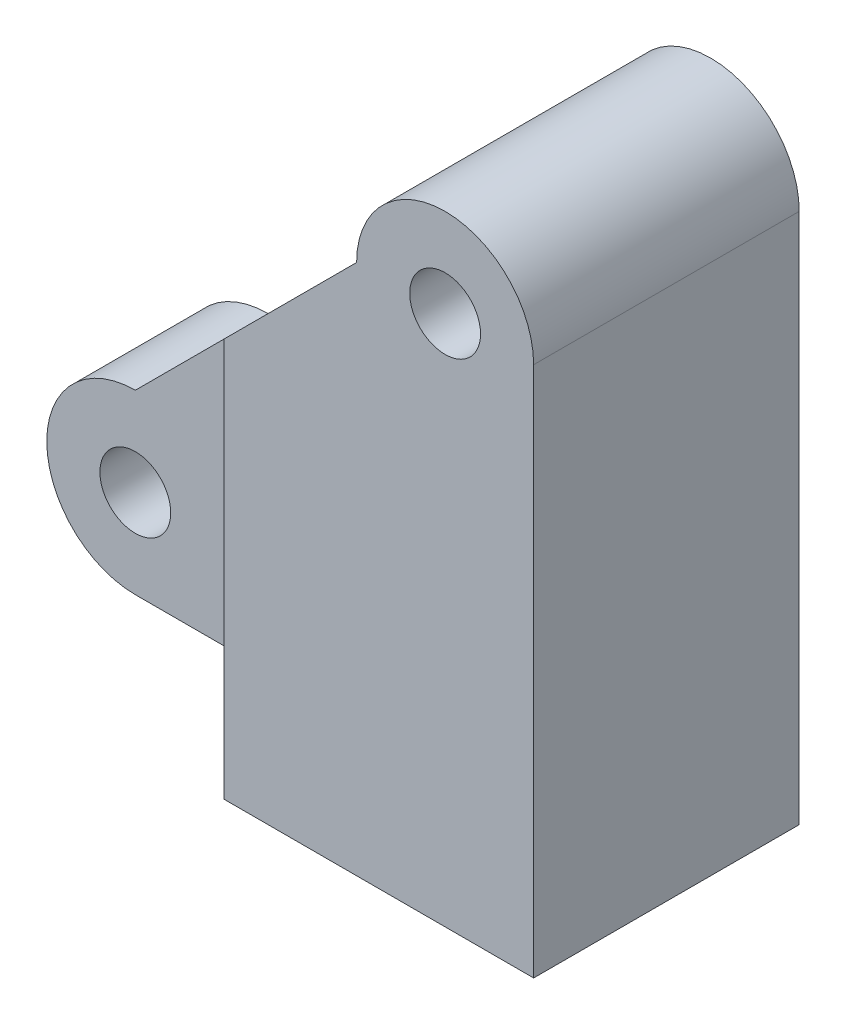
ISO-10303-21;
HEADER;
FILE_DESCRIPTION(('STEP AP214'),'2;1');
FILE_NAME('part.step','',(''),(''),'','','');
FILE_SCHEMA(('AUTOMOTIVE_DESIGN { 1 0 10303 214 1 1 1 1 }'));
ENDSEC;
DATA;
#1=APPLICATION_CONTEXT('core data for automotive mechanical design processes');
#2=APPLICATION_PROTOCOL_DEFINITION('international standard','automotive_design',2000,#1);
#3=PRODUCT_CONTEXT('',#1,'mechanical');
#4=PRODUCT('Part','Part','',(#3));
#5=PRODUCT_RELATED_PRODUCT_CATEGORY('part','',(#4));
#6=PRODUCT_DEFINITION_FORMATION('','',#4);
#7=PRODUCT_DEFINITION_CONTEXT('part definition',#1,'design');
#8=PRODUCT_DEFINITION('design','',#6,#7);
#9=PRODUCT_DEFINITION_SHAPE('','',#8);
#10=(LENGTH_UNIT() NAMED_UNIT(*) SI_UNIT(.MILLI.,.METRE.));
#11=(NAMED_UNIT(*) PLANE_ANGLE_UNIT() SI_UNIT($,.RADIAN.));
#12=(NAMED_UNIT(*) SI_UNIT($,.STERADIAN.) SOLID_ANGLE_UNIT());
#13=UNCERTAINTY_MEASURE_WITH_UNIT(LENGTH_MEASURE(1.E-05),#10,'distance_accuracy_value','');
#14=(GEOMETRIC_REPRESENTATION_CONTEXT(3) GLOBAL_UNCERTAINTY_ASSIGNED_CONTEXT((#13)) GLOBAL_UNIT_ASSIGNED_CONTEXT((#10,
#11,#12)) REPRESENTATION_CONTEXT('',''));
#15=CARTESIAN_POINT('',(0.,0.,0.));
#16=DIRECTION('',(0.,0.,1.));
#17=DIRECTION('',(1.,0.,0.));
#18=AXIS2_PLACEMENT_3D('',#15,#16,#17);
#19=CARTESIAN_POINT('',(0.,0.,30.));
#20=DIRECTION('',(0.,0.,-1.));
#21=DIRECTION('',(-1.,0.,0.));
#22=AXIS2_PLACEMENT_3D('',#19,#20,#21);
#23=CYLINDRICAL_SURFACE('',#22,10.);
#24=CARTESIAN_POINT('',(0.,0.,15.));
#25=DIRECTION('',(0.,0.,1.));
#26=DIRECTION('',(1.,0.,0.));
#27=AXIS2_PLACEMENT_3D('',#24,#25,#26);
#28=CIRCLE('',#27,10.);
#29=CARTESIAN_POINT('',(0.,9.99999999999999,15.));
#30=VERTEX_POINT('',#29);
#31=CARTESIAN_POINT('',(0.,-10.,15.));
#32=VERTEX_POINT('',#31);
#33=EDGE_CURVE('E114',#30,#32,#28,.T.);
#34=ORIENTED_EDGE('',*,*,#33,.F.);
#35=DIRECTION('',(0.,0.,-1.));
#36=VECTOR('',#35,1.);
#37=CARTESIAN_POINT('',(0.,10.,30.));
#38=LINE('',#37,#36);
#39=CARTESIAN_POINT('',(0.,10.,0.));
#40=VERTEX_POINT('',#39);
#41=EDGE_CURVE('E83',#30,#40,#38,.T.);
#42=ORIENTED_EDGE('',*,*,#41,.T.);
#43=CARTESIAN_POINT('',(0.,0.,0.));
#44=DIRECTION('',(0.,0.,1.));
#45=DIRECTION('',(1.,0.,0.));
#46=AXIS2_PLACEMENT_3D('',#43,#44,#45);
#47=CIRCLE('',#46,10.);
#48=CARTESIAN_POINT('',(0.,-10.,0.));
#49=VERTEX_POINT('',#48);
#50=EDGE_CURVE('E132',#40,#49,#47,.T.);
#51=ORIENTED_EDGE('',*,*,#50,.T.);
#52=DIRECTION('',(0.,0.,-1.));
#53=VECTOR('',#52,1.);
#54=CARTESIAN_POINT('',(0.,-10.,30.));
#55=LINE('',#54,#53);
#56=EDGE_CURVE('E11',#32,#49,#55,.T.);
#57=ORIENTED_EDGE('',*,*,#56,.F.);
#58=EDGE_LOOP('',(#34,#42,#51,#57));
#59=FACE_BOUND('',#58,.T.);
#60=ADVANCED_FACE('F37',(#59),#23,.T.);
#61=CARTESIAN_POINT('',(0.,0.,30.));
#62=DIRECTION('',(0.,0.,-1.));
#63=DIRECTION('',(-1.,0.,0.));
#64=AXIS2_PLACEMENT_3D('',#61,#62,#63);
#65=CYLINDRICAL_SURFACE('',#64,4.);
#66=CARTESIAN_POINT('',(0.,0.,0.));
#67=DIRECTION('',(0.,0.,1.));
#68=DIRECTION('',(1.,0.,0.));
#69=AXIS2_PLACEMENT_3D('',#66,#67,#68);
#70=CIRCLE('',#69,4.);
#71=CARTESIAN_POINT('',(4.,0.,0.));
#72=VERTEX_POINT('',#71);
#73=EDGE_CURVE('E121',#72,#72,#70,.T.);
#74=ORIENTED_EDGE('',*,*,#73,.F.);
#75=EDGE_LOOP('',(#74));
#76=FACE_BOUND('',#75,.T.);
#77=CARTESIAN_POINT('',(0.,0.,15.));
#78=DIRECTION('',(0.,0.,1.));
#79=DIRECTION('',(1.,0.,0.));
#80=AXIS2_PLACEMENT_3D('',#77,#78,#79);
#81=CIRCLE('',#80,4.);
#82=CARTESIAN_POINT('',(4.,0.,15.));
#83=VERTEX_POINT('',#82);
#84=EDGE_CURVE('E117',#83,#83,#81,.F.);
#85=ORIENTED_EDGE('',*,*,#84,.F.);
#86=EDGE_LOOP('',(#85));
#87=FACE_BOUND('',#86,.T.);
#88=ADVANCED_FACE('F181',(#76,#87),#65,.F.);
#89=CARTESIAN_POINT('',(0.,0.,30.));
#90=DIRECTION('',(0.,0.,1.));
#91=DIRECTION('',(1.,0.,0.));
#92=AXIS2_PLACEMENT_3D('',#89,#90,#91);
#93=PLANE('',#92);
#94=DIRECTION('',(0.,1.,0.));
#95=VECTOR('',#94,1.);
#96=CARTESIAN_POINT('',(25.,0.,30.));
#97=LINE('',#96,#95);
#98=CARTESIAN_POINT('',(25.,-10.,30.));
#99=VERTEX_POINT('',#98);
#100=CARTESIAN_POINT('',(25.,35.,30.));
#101=VERTEX_POINT('',#100);
#102=EDGE_CURVE('E176',#99,#101,#97,.T.);
#103=ORIENTED_EDGE('',*,*,#102,.F.);
#104=DIRECTION('',(1.,0.,0.));
#105=VECTOR('',#104,1.);
#106=CARTESIAN_POINT('',(0.,-10.,30.));
#107=LINE('',#106,#105);
#108=CARTESIAN_POINT('',(60.,-10.,30.));
#109=VERTEX_POINT('',#108);
#110=EDGE_CURVE('E88',#99,#109,#107,.T.);
#111=ORIENTED_EDGE('',*,*,#110,.T.);
#112=DIRECTION('',(0.,1.,0.));
#113=VECTOR('',#112,1.);
#114=CARTESIAN_POINT('',(60.,-10.,30.));
#115=LINE('',#114,#113);
#116=CARTESIAN_POINT('',(60.,50.,30.));
#117=VERTEX_POINT('',#116);
#118=EDGE_CURVE('E136',#109,#117,#115,.T.);
#119=ORIENTED_EDGE('',*,*,#118,.T.);
#120=CARTESIAN_POINT('',(50.,50.,30.));
#121=DIRECTION('',(0.,0.,1.));
#122=DIRECTION('',(1.,0.,0.));
#123=AXIS2_PLACEMENT_3D('',#120,#121,#122);
#124=CIRCLE('',#123,10.);
#125=CARTESIAN_POINT('',(40.,50.,30.));
#126=VERTEX_POINT('',#125);
#127=EDGE_CURVE('E60',#117,#126,#124,.T.);
#128=ORIENTED_EDGE('',*,*,#127,.T.);
#129=DIRECTION('',(-0.707106781186548,-0.707106781186548,0.));
#130=VECTOR('',#129,1.);
#131=CARTESIAN_POINT('',(40.,50.,30.));
#132=LINE('',#131,#130);
#133=EDGE_CURVE('E140',#126,#101,#132,.T.);
#134=ORIENTED_EDGE('',*,*,#133,.T.);
#135=EDGE_LOOP('',(#103,#111,#119,#128,#134));
#136=FACE_BOUND('',#135,.T.);
#137=CARTESIAN_POINT('',(50.,50.,30.));
#138=DIRECTION('',(0.,0.,1.));
#139=DIRECTION('',(1.,0.,0.));
#140=AXIS2_PLACEMENT_3D('',#137,#138,#139);
#141=CIRCLE('',#140,4.00000000000001);
#142=CARTESIAN_POINT('',(54.,50.,30.));
#143=VERTEX_POINT('',#142);
#144=EDGE_CURVE('E129',#143,#143,#141,.T.);
#145=ORIENTED_EDGE('',*,*,#144,.F.);
#146=EDGE_LOOP('',(#145));
#147=FACE_BOUND('',#146,.T.);
#148=ADVANCED_FACE('F174',(#136,#147),#93,.T.);
#149=CARTESIAN_POINT('',(0.,0.,0.));
#150=DIRECTION('',(0.,0.,1.));
#151=DIRECTION('',(1.,0.,0.));
#152=AXIS2_PLACEMENT_3D('',#149,#150,#151);
#153=PLANE('',#152);
#154=ORIENTED_EDGE('',*,*,#50,.F.);
#155=DIRECTION('',(-0.707106781186548,-0.707106781186548,0.));
#156=VECTOR('',#155,1.);
#157=CARTESIAN_POINT('',(40.,50.,0.));
#158=LINE('',#157,#156);
#159=CARTESIAN_POINT('',(40.,50.,0.));
#160=VERTEX_POINT('',#159);
#161=EDGE_CURVE('E137',#160,#40,#158,.T.);
#162=ORIENTED_EDGE('',*,*,#161,.F.);
#163=CARTESIAN_POINT('',(50.,50.,0.));
#164=DIRECTION('',(0.,0.,1.));
#165=DIRECTION('',(1.,0.,0.));
#166=AXIS2_PLACEMENT_3D('',#163,#164,#165);
#167=CIRCLE('',#166,10.);
#168=CARTESIAN_POINT('',(60.,50.,0.));
#169=VERTEX_POINT('',#168);
#170=EDGE_CURVE('E147',#169,#160,#167,.T.);
#171=ORIENTED_EDGE('',*,*,#170,.F.);
#172=DIRECTION('',(0.,1.,0.));
#173=VECTOR('',#172,1.);
#174=CARTESIAN_POINT('',(60.,-10.,0.));
#175=LINE('',#174,#173);
#176=CARTESIAN_POINT('',(60.,-10.,0.));
#177=VERTEX_POINT('',#176);
#178=EDGE_CURVE('E145',#177,#169,#175,.T.);
#179=ORIENTED_EDGE('',*,*,#178,.F.);
#180=DIRECTION('',(1.,0.,0.));
#181=VECTOR('',#180,1.);
#182=CARTESIAN_POINT('',(0.,-10.,0.));
#183=LINE('',#182,#181);
#184=EDGE_CURVE('E143',#49,#177,#183,.T.);
#185=ORIENTED_EDGE('',*,*,#184,.F.);
#186=EDGE_LOOP('',(#154,#162,#171,#179,#185));
#187=FACE_BOUND('',#186,.T.);
#188=CARTESIAN_POINT('',(50.,50.,0.));
#189=DIRECTION('',(0.,0.,1.));
#190=DIRECTION('',(1.,0.,0.));
#191=AXIS2_PLACEMENT_3D('',#188,#189,#190);
#192=CIRCLE('',#191,4.00000000000001);
#193=CARTESIAN_POINT('',(54.,50.,0.));
#194=VERTEX_POINT('',#193);
#195=EDGE_CURVE('E128',#194,#194,#192,.T.);
#196=ORIENTED_EDGE('',*,*,#195,.T.);
#197=EDGE_LOOP('',(#196));
#198=FACE_BOUND('',#197,.T.);
#199=ORIENTED_EDGE('',*,*,#73,.T.);
#200=EDGE_LOOP('',(#199));
#201=FACE_BOUND('',#200,.T.);
#202=ADVANCED_FACE('F166',(#187,#198,#201),#153,.F.);
#203=CARTESIAN_POINT('',(0.,-10.,30.));
#204=DIRECTION('',(0.,1.,0.));
#205=DIRECTION('',(0.,0.,1.));
#206=AXIS2_PLACEMENT_3D('',#203,#204,#205);
#207=PLANE('',#206);
#208=ORIENTED_EDGE('',*,*,#110,.F.);
#209=DIRECTION('',(0.,0.,1.));
#210=VECTOR('',#209,1.);
#211=CARTESIAN_POINT('',(25.,-10.,15.));
#212=LINE('',#211,#210);
#213=CARTESIAN_POINT('',(25.,-10.,15.));
#214=VERTEX_POINT('',#213);
#215=EDGE_CURVE('E105',#214,#99,#212,.T.);
#216=ORIENTED_EDGE('',*,*,#215,.F.);
#217=DIRECTION('',(1.,0.,0.));
#218=VECTOR('',#217,1.);
#219=CARTESIAN_POINT('',(0.,-10.,15.));
#220=LINE('',#219,#218);
#221=EDGE_CURVE('E110',#32,#214,#220,.T.);
#222=ORIENTED_EDGE('',*,*,#221,.F.);
#223=ORIENTED_EDGE('',*,*,#56,.T.);
#224=ORIENTED_EDGE('',*,*,#184,.T.);
#225=DIRECTION('',(0.,0.,-1.));
#226=VECTOR('',#225,1.);
#227=CARTESIAN_POINT('',(60.,-10.,30.));
#228=LINE('',#227,#226);
#229=EDGE_CURVE('E44',#109,#177,#228,.T.);
#230=ORIENTED_EDGE('',*,*,#229,.F.);
#231=EDGE_LOOP('',(#208,#216,#222,#223,#224,#230));
#232=FACE_BOUND('',#231,.T.);
#233=ADVANCED_FACE('F119',(#232),#207,.F.);
#234=CARTESIAN_POINT('',(60.,-10.,30.));
#235=DIRECTION('',(-1.,0.,0.));
#236=DIRECTION('',(0.,0.,1.));
#237=AXIS2_PLACEMENT_3D('',#234,#235,#236);
#238=PLANE('',#237);
#239=ORIENTED_EDGE('',*,*,#178,.T.);
#240=DIRECTION('',(0.,0.,-1.));
#241=VECTOR('',#240,1.);
#242=CARTESIAN_POINT('',(60.,50.,30.));
#243=LINE('',#242,#241);
#244=EDGE_CURVE('E154',#117,#169,#243,.T.);
#245=ORIENTED_EDGE('',*,*,#244,.F.);
#246=ORIENTED_EDGE('',*,*,#118,.F.);
#247=ORIENTED_EDGE('',*,*,#229,.T.);
#248=EDGE_LOOP('',(#239,#245,#246,#247));
#249=FACE_BOUND('',#248,.T.);
#250=ADVANCED_FACE('F160',(#249),#238,.F.);
#251=CARTESIAN_POINT('',(50.,50.,30.));
#252=DIRECTION('',(0.,0.,-1.));
#253=DIRECTION('',(-1.,0.,0.));
#254=AXIS2_PLACEMENT_3D('',#251,#252,#253);
#255=CYLINDRICAL_SURFACE('',#254,10.);
#256=ORIENTED_EDGE('',*,*,#170,.T.);
#257=DIRECTION('',(0.,0.,-1.));
#258=VECTOR('',#257,1.);
#259=CARTESIAN_POINT('',(40.,50.,30.));
#260=LINE('',#259,#258);
#261=EDGE_CURVE('E151',#126,#160,#260,.T.);
#262=ORIENTED_EDGE('',*,*,#261,.F.);
#263=ORIENTED_EDGE('',*,*,#127,.F.);
#264=ORIENTED_EDGE('',*,*,#244,.T.);
#265=EDGE_LOOP('',(#256,#262,#263,#264));
#266=FACE_BOUND('',#265,.T.);
#267=ADVANCED_FACE('F170',(#266),#255,.T.);
#268=CARTESIAN_POINT('',(40.,50.,30.));
#269=DIRECTION('',(0.707106781186547,-0.707106781186547,0.));
#270=DIRECTION('',(0.707106781186548,0.707106781186548,0.));
#271=AXIS2_PLACEMENT_3D('',#268,#269,#270);
#272=PLANE('',#271);
#273=DIRECTION('',(-0.707106781186548,-0.707106781186548,0.));
#274=VECTOR('',#273,1.);
#275=CARTESIAN_POINT('',(-5.,5.,15.));
#276=LINE('',#275,#274);
#277=CARTESIAN_POINT('',(25.,35.,15.));
#278=VERTEX_POINT('',#277);
#279=EDGE_CURVE('E109',#278,#30,#276,.T.);
#280=ORIENTED_EDGE('',*,*,#279,.F.);
#281=DIRECTION('',(0.,0.,1.));
#282=VECTOR('',#281,1.);
#283=CARTESIAN_POINT('',(25.,35.,15.));
#284=LINE('',#283,#282);
#285=EDGE_CURVE('E107',#278,#101,#284,.T.);
#286=ORIENTED_EDGE('',*,*,#285,.T.);
#287=ORIENTED_EDGE('',*,*,#133,.F.);
#288=ORIENTED_EDGE('',*,*,#261,.T.);
#289=ORIENTED_EDGE('',*,*,#161,.T.);
#290=ORIENTED_EDGE('',*,*,#41,.F.);
#291=EDGE_LOOP('',(#280,#286,#287,#288,#289,#290));
#292=FACE_BOUND('',#291,.T.);
#293=ADVANCED_FACE('F173',(#292),#272,.F.);
#294=CARTESIAN_POINT('',(50.,50.,30.));
#295=DIRECTION('',(0.,0.,-1.));
#296=DIRECTION('',(-1.,0.,0.));
#297=AXIS2_PLACEMENT_3D('',#294,#295,#296);
#298=CYLINDRICAL_SURFACE('',#297,4.00000000000001);
#299=ORIENTED_EDGE('',*,*,#144,.T.);
#300=EDGE_LOOP('',(#299));
#301=FACE_BOUND('',#300,.T.);
#302=ORIENTED_EDGE('',*,*,#195,.F.);
#303=EDGE_LOOP('',(#302));
#304=FACE_BOUND('',#303,.T.);
#305=ADVANCED_FACE('F196',(#301,#304),#298,.F.);
#306=CARTESIAN_POINT('',(25.,0.,15.));
#307=DIRECTION('',(1.,0.,0.));
#308=DIRECTION('',(0.,1.,0.));
#309=AXIS2_PLACEMENT_3D('',#306,#307,#308);
#310=PLANE('',#309);
#311=ORIENTED_EDGE('',*,*,#102,.T.);
#312=ORIENTED_EDGE('',*,*,#285,.F.);
#313=DIRECTION('',(0.,1.,0.));
#314=VECTOR('',#313,1.);
#315=CARTESIAN_POINT('',(25.,0.,15.));
#316=LINE('',#315,#314);
#317=EDGE_CURVE('E51',#214,#278,#316,.T.);
#318=ORIENTED_EDGE('',*,*,#317,.F.);
#319=ORIENTED_EDGE('',*,*,#215,.T.);
#320=EDGE_LOOP('',(#311,#312,#318,#319));
#321=FACE_BOUND('',#320,.T.);
#322=ADVANCED_FACE('F103',(#321),#310,.F.);
#323=CARTESIAN_POINT('',(0.,0.,15.));
#324=DIRECTION('',(0.,0.,1.));
#325=DIRECTION('',(1.,0.,0.));
#326=AXIS2_PLACEMENT_3D('',#323,#324,#325);
#327=PLANE('',#326);
#328=ORIENTED_EDGE('',*,*,#84,.T.);
#329=EDGE_LOOP('',(#328));
#330=FACE_BOUND('',#329,.T.);
#331=ORIENTED_EDGE('',*,*,#221,.T.);
#332=ORIENTED_EDGE('',*,*,#317,.T.);
#333=ORIENTED_EDGE('',*,*,#279,.T.);
#334=ORIENTED_EDGE('',*,*,#33,.T.);
#335=EDGE_LOOP('',(#331,#332,#333,#334));
#336=FACE_BOUND('',#335,.T.);
#337=ADVANCED_FACE('F113',(#330,#336),#327,.T.);
#338=CLOSED_SHELL('',(#60,#88,#148,#202,#233,#250,#267,#293,#305,#322,#337));
#339=MANIFOLD_SOLID_BREP('B2',#338);
#340=ADVANCED_BREP_SHAPE_REPRESENTATION('',(#18,#339),#14);
#341=SHAPE_DEFINITION_REPRESENTATION(#9,#340);
ENDSEC;
END-ISO-10303-21;
